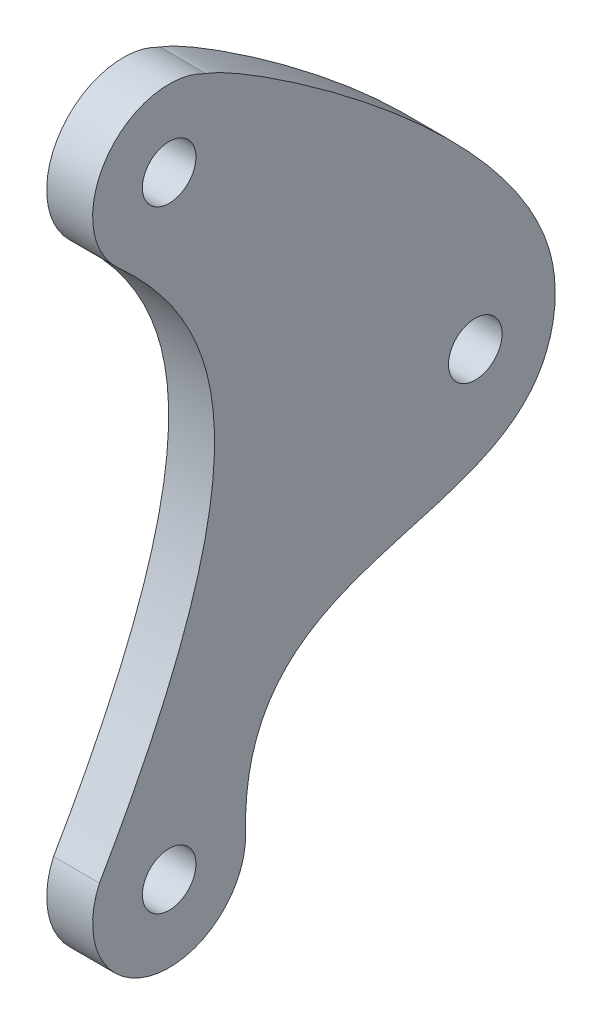
ISO-10303-21;
HEADER;
FILE_DESCRIPTION(('STEP AP214'),'2;1');
FILE_NAME('part.step','',(''),(''),'','','');
FILE_SCHEMA(('AUTOMOTIVE_DESIGN { 1 0 10303 214 1 1 1 1 }'));
ENDSEC;
DATA;
#1=APPLICATION_CONTEXT('core data for automotive mechanical design processes');
#2=APPLICATION_PROTOCOL_DEFINITION('international standard','automotive_design',2000,#1);
#3=PRODUCT_CONTEXT('',#1,'mechanical');
#4=PRODUCT('Part','Part','',(#3));
#5=PRODUCT_RELATED_PRODUCT_CATEGORY('part','',(#4));
#6=PRODUCT_DEFINITION_FORMATION('','',#4);
#7=PRODUCT_DEFINITION_CONTEXT('part definition',#1,'design');
#8=PRODUCT_DEFINITION('design','',#6,#7);
#9=PRODUCT_DEFINITION_SHAPE('','',#8);
#10=(LENGTH_UNIT() NAMED_UNIT(*) SI_UNIT(.MILLI.,.METRE.));
#11=(NAMED_UNIT(*) PLANE_ANGLE_UNIT() SI_UNIT($,.RADIAN.));
#12=(NAMED_UNIT(*) SI_UNIT($,.STERADIAN.) SOLID_ANGLE_UNIT());
#13=UNCERTAINTY_MEASURE_WITH_UNIT(LENGTH_MEASURE(1.E-05),#10,'distance_accuracy_value','');
#14=(GEOMETRIC_REPRESENTATION_CONTEXT(3) GLOBAL_UNCERTAINTY_ASSIGNED_CONTEXT((#13)) GLOBAL_UNIT_ASSIGNED_CONTEXT((#10,
#11,#12)) REPRESENTATION_CONTEXT('',''));
#15=CARTESIAN_POINT('',(0.,0.,0.));
#16=DIRECTION('',(0.,0.,1.));
#17=DIRECTION('',(1.,0.,0.));
#18=AXIS2_PLACEMENT_3D('',#15,#16,#17);
#19=CARTESIAN_POINT('',(3.,-2.09869982231491,-4.78923416984507));
#20=DIRECTION('',(1.,0.,0.));
#21=DIRECTION('',(0.,0.,-1.));
#22=AXIS2_PLACEMENT_3D('',#19,#20,#21);
#23=PLANE('',#22);
#24=CARTESIAN_POINT('',(3.,0.,0.));
#25=DIRECTION('',(1.,0.,0.));
#26=DIRECTION('',(0.,0.,-1.));
#27=AXIS2_PLACEMENT_3D('',#24,#25,#26);
#28=CIRCLE('',#27,1.75);
#29=CARTESIAN_POINT('',(3.,0.,-1.75));
#30=VERTEX_POINT('',#29);
#31=EDGE_CURVE('E147',#30,#30,#28,.T.);
#32=ORIENTED_EDGE('',*,*,#31,.F.);
#33=EDGE_LOOP('',(#32));
#34=FACE_BOUND('',#33,.T.);
#35=CARTESIAN_POINT('',(3.,-20.,15.));
#36=CARTESIAN_POINT('',(3.,-5.27096671163853,15.4667605474883));
#37=CARTESIAN_POINT('',(3.,-11.668910874409,-3.89793613911947));
#38=CARTESIAN_POINT('',(3.,9.64796348627327,-6.64863091226332));
#39=CARTESIAN_POINT('',(3.,23.8968573471168,15.5632119029051));
#40=CARTESIAN_POINT('',(3.,24.3598202807627,17.5521505112752));
#41=B_SPLINE_CURVE_WITH_KNOTS('',3,(#35,#36,#37,#38,#39,#40),.UNSPECIFIED.,.F.,.F.,(4,1,1,4),
(0.,0.482956450976032,0.582956450976032,1.),.UNSPECIFIED.);
#42=CARTESIAN_POINT('',(3.,-20.,15.));
#43=VERTEX_POINT('',#42);
#44=CARTESIAN_POINT('',(3.,24.3598202807627,17.5521505112753));
#45=VERTEX_POINT('',#44);
#46=EDGE_CURVE('E85',#43,#45,#41,.T.);
#47=ORIENTED_EDGE('',*,*,#46,.T.);
#48=CARTESIAN_POINT('',(3.,20.,20.));
#49=DIRECTION('',(1.,0.,0.));
#50=DIRECTION('',(0.,0.,-1.));
#51=AXIS2_PLACEMENT_3D('',#48,#49,#50);
#52=CIRCLE('',#51,5.);
#53=CARTESIAN_POINT('',(3.,16.4362249526584,23.5070653560983));
#54=VERTEX_POINT('',#53);
#55=EDGE_CURVE('E80',#45,#54,#52,.T.);
#56=ORIENTED_EDGE('',*,*,#55,.T.);
#57=CARTESIAN_POINT('',(3.,16.4362249526584,23.5070653560983));
#58=CARTESIAN_POINT('',(3.,9.61233454350743,15.9412169681942));
#59=CARTESIAN_POINT('',(3.,1.19356584508964,13.4830331726943));
#60=CARTESIAN_POINT('',(3.,-17.9320628826746,24.5523220535006));
#61=B_SPLINE_CURVE_WITH_KNOTS('',3,(#57,#58,#59,#60),.UNSPECIFIED.,.F.,.F.,(4,4),(0.,1.),.UNSPECIFIED.);
#62=CARTESIAN_POINT('',(3.,-17.9320628826746,24.5523220535006));
#63=VERTEX_POINT('',#62);
#64=EDGE_CURVE('E83',#54,#63,#61,.T.);
#65=ORIENTED_EDGE('',*,*,#64,.T.);
#66=CARTESIAN_POINT('',(3.,-20.,20.));
#67=DIRECTION('',(1.,0.,0.));
#68=DIRECTION('',(0.,0.,-1.));
#69=AXIS2_PLACEMENT_3D('',#66,#67,#68);
#70=CIRCLE('',#69,5.);
#71=EDGE_CURVE('E50',#63,#43,#70,.T.);
#72=ORIENTED_EDGE('',*,*,#71,.T.);
#73=EDGE_LOOP('',(#47,#56,#65,#72));
#74=FACE_BOUND('',#73,.T.);
#75=CARTESIAN_POINT('',(3.,20.,20.));
#76=DIRECTION('',(1.,0.,0.));
#77=DIRECTION('',(0.,0.,-1.));
#78=AXIS2_PLACEMENT_3D('',#75,#76,#77);
#79=CIRCLE('',#78,1.75);
#80=CARTESIAN_POINT('',(3.,20.,18.25));
#81=VERTEX_POINT('',#80);
#82=EDGE_CURVE('E153',#81,#81,#79,.T.);
#83=ORIENTED_EDGE('',*,*,#82,.F.);
#84=EDGE_LOOP('',(#83));
#85=FACE_BOUND('',#84,.T.);
#86=CARTESIAN_POINT('',(3.,-20.,20.));
#87=DIRECTION('',(1.,0.,0.));
#88=DIRECTION('',(0.,0.,-1.));
#89=AXIS2_PLACEMENT_3D('',#86,#87,#88);
#90=CIRCLE('',#89,1.75);
#91=CARTESIAN_POINT('',(3.,-20.,18.25));
#92=VERTEX_POINT('',#91);
#93=EDGE_CURVE('E138',#92,#92,#90,.T.);
#94=ORIENTED_EDGE('',*,*,#93,.F.);
#95=EDGE_LOOP('',(#94));
#96=FACE_BOUND('',#95,.T.);
#97=ADVANCED_FACE('F32',(#34,#74,#85,#96),#23,.T.);
#98=CARTESIAN_POINT('',(0.,-2.09869982231491,-4.78923416984507));
#99=DIRECTION('',(1.,0.,0.));
#100=DIRECTION('',(0.,0.,-1.));
#101=AXIS2_PLACEMENT_3D('',#98,#99,#100);
#102=PLANE('',#101);
#103=CARTESIAN_POINT('',(0.,0.,0.));
#104=DIRECTION('',(1.,0.,0.));
#105=DIRECTION('',(0.,0.,-1.));
#106=AXIS2_PLACEMENT_3D('',#103,#104,#105);
#107=CIRCLE('',#106,1.75);
#108=CARTESIAN_POINT('',(0.,0.,-1.75));
#109=VERTEX_POINT('',#108);
#110=EDGE_CURVE('E144',#109,#109,#107,.T.);
#111=ORIENTED_EDGE('',*,*,#110,.T.);
#112=EDGE_LOOP('',(#111));
#113=FACE_BOUND('',#112,.T.);
#114=CARTESIAN_POINT('',(0.,-20.,15.));
#115=CARTESIAN_POINT('',(0.,-5.27096671163853,15.4667605474883));
#116=CARTESIAN_POINT('',(0.,-11.668910874409,-3.89793613911947));
#117=CARTESIAN_POINT('',(0.,9.64796348627327,-6.64863091226332));
#118=CARTESIAN_POINT('',(0.,23.8968573471168,15.5632119029051));
#119=CARTESIAN_POINT('',(0.,24.3598202807627,17.5521505112752));
#120=B_SPLINE_CURVE_WITH_KNOTS('',3,(#114,#115,#116,#117,#118,#119),.UNSPECIFIED.,.F.,.F.,(4,1,
1,4),(0.,0.482956450976032,0.582956450976032,1.),.UNSPECIFIED.);
#121=CARTESIAN_POINT('',(0.,-20.,15.));
#122=VERTEX_POINT('',#121);
#123=CARTESIAN_POINT('',(0.,24.3598202807627,17.5521505112753));
#124=VERTEX_POINT('',#123);
#125=EDGE_CURVE('E156',#122,#124,#120,.T.);
#126=ORIENTED_EDGE('',*,*,#125,.F.);
#127=CARTESIAN_POINT('',(0.,-20.,20.));
#128=DIRECTION('',(1.,0.,0.));
#129=DIRECTION('',(0.,0.,-1.));
#130=AXIS2_PLACEMENT_3D('',#127,#128,#129);
#131=CIRCLE('',#130,5.);
#132=CARTESIAN_POINT('',(0.,-17.9320628826746,24.5523220535006));
#133=VERTEX_POINT('',#132);
#134=EDGE_CURVE('E73',#133,#122,#131,.T.);
#135=ORIENTED_EDGE('',*,*,#134,.F.);
#136=CARTESIAN_POINT('',(0.,16.4362249526584,23.5070653560983));
#137=CARTESIAN_POINT('',(0.,9.61233454350743,15.9412169681942));
#138=CARTESIAN_POINT('',(0.,1.19356584508964,13.4830331726943));
#139=CARTESIAN_POINT('',(0.,-17.9320628826746,24.5523220535006));
#140=B_SPLINE_CURVE_WITH_KNOTS('',3,(#136,#137,#138,#139),.UNSPECIFIED.,.F.,.F.,(4,4),(0.,1.),.UNSPECIFIED.);
#141=CARTESIAN_POINT('',(0.,16.4362249526584,23.5070653560983));
#142=VERTEX_POINT('',#141);
#143=EDGE_CURVE('E67',#142,#133,#140,.T.);
#144=ORIENTED_EDGE('',*,*,#143,.F.);
#145=CARTESIAN_POINT('',(0.,20.,20.));
#146=DIRECTION('',(1.,0.,0.));
#147=DIRECTION('',(0.,0.,-1.));
#148=AXIS2_PLACEMENT_3D('',#145,#146,#147);
#149=CIRCLE('',#148,5.);
#150=EDGE_CURVE('E89',#124,#142,#149,.T.);
#151=ORIENTED_EDGE('',*,*,#150,.F.);
#152=EDGE_LOOP('',(#126,#135,#144,#151));
#153=FACE_BOUND('',#152,.T.);
#154=CARTESIAN_POINT('',(0.,20.,20.));
#155=DIRECTION('',(1.,0.,0.));
#156=DIRECTION('',(0.,0.,-1.));
#157=AXIS2_PLACEMENT_3D('',#154,#155,#156);
#158=CIRCLE('',#157,1.75);
#159=CARTESIAN_POINT('',(0.,20.,18.25));
#160=VERTEX_POINT('',#159);
#161=EDGE_CURVE('E150',#160,#160,#158,.T.);
#162=ORIENTED_EDGE('',*,*,#161,.T.);
#163=EDGE_LOOP('',(#162));
#164=FACE_BOUND('',#163,.T.);
#165=CARTESIAN_POINT('',(0.,-20.,20.));
#166=DIRECTION('',(1.,0.,0.));
#167=DIRECTION('',(0.,0.,-1.));
#168=AXIS2_PLACEMENT_3D('',#165,#166,#167);
#169=CIRCLE('',#168,1.75);
#170=CARTESIAN_POINT('',(0.,-20.,18.25));
#171=VERTEX_POINT('',#170);
#172=EDGE_CURVE('E141',#171,#171,#169,.T.);
#173=ORIENTED_EDGE('',*,*,#172,.T.);
#174=EDGE_LOOP('',(#173));
#175=FACE_BOUND('',#174,.T.);
#176=ADVANCED_FACE('F111',(#113,#153,#164,#175),#102,.F.);
#177=DIRECTION('',(-1.,0.,0.));
#178=VECTOR('',#177,1.);
#179=SURFACE_OF_LINEAR_EXTRUSION('',#41,#178);
#180=ORIENTED_EDGE('',*,*,#125,.T.);
#181=DIRECTION('',(-1.,0.,0.));
#182=VECTOR('',#181,1.);
#183=CARTESIAN_POINT('',(3.,24.3598202807627,17.5521505112753));
#184=LINE('',#183,#182);
#185=EDGE_CURVE('E11',#45,#124,#184,.T.);
#186=ORIENTED_EDGE('',*,*,#185,.F.);
#187=ORIENTED_EDGE('',*,*,#46,.F.);
#188=DIRECTION('',(-1.,0.,0.));
#189=VECTOR('',#188,1.);
#190=CARTESIAN_POINT('',(3.,-20.,15.));
#191=LINE('',#190,#189);
#192=EDGE_CURVE('E93',#43,#122,#191,.T.);
#193=ORIENTED_EDGE('',*,*,#192,.T.);
#194=EDGE_LOOP('',(#180,#186,#187,#193));
#195=FACE_BOUND('',#194,.T.);
#196=ADVANCED_FACE('F34',(#195),#179,.F.);
#197=CARTESIAN_POINT('',(3.,20.,20.));
#198=DIRECTION('',(-1.,0.,0.));
#199=DIRECTION('',(0.,0.,1.));
#200=AXIS2_PLACEMENT_3D('',#197,#198,#199);
#201=CYLINDRICAL_SURFACE('',#200,5.);
#202=ORIENTED_EDGE('',*,*,#150,.T.);
#203=DIRECTION('',(-1.,0.,0.));
#204=VECTOR('',#203,1.);
#205=CARTESIAN_POINT('',(3.,16.4362249526584,23.5070653560983));
#206=LINE('',#205,#204);
#207=EDGE_CURVE('E42',#54,#142,#206,.T.);
#208=ORIENTED_EDGE('',*,*,#207,.F.);
#209=ORIENTED_EDGE('',*,*,#55,.F.);
#210=ORIENTED_EDGE('',*,*,#185,.T.);
#211=EDGE_LOOP('',(#202,#208,#209,#210));
#212=FACE_BOUND('',#211,.T.);
#213=ADVANCED_FACE('F88',(#212),#201,.T.);
#214=DIRECTION('',(-1.,0.,0.));
#215=VECTOR('',#214,1.);
#216=SURFACE_OF_LINEAR_EXTRUSION('',#61,#215);
#217=ORIENTED_EDGE('',*,*,#143,.T.);
#218=DIRECTION('',(-1.,0.,0.));
#219=VECTOR('',#218,1.);
#220=CARTESIAN_POINT('',(3.,-17.9320628826746,24.5523220535006));
#221=LINE('',#220,#219);
#222=EDGE_CURVE('E90',#63,#133,#221,.T.);
#223=ORIENTED_EDGE('',*,*,#222,.F.);
#224=ORIENTED_EDGE('',*,*,#64,.F.);
#225=ORIENTED_EDGE('',*,*,#207,.T.);
#226=EDGE_LOOP('',(#217,#223,#224,#225));
#227=FACE_BOUND('',#226,.T.);
#228=ADVANCED_FACE('F91',(#227),#216,.F.);
#229=CARTESIAN_POINT('',(3.,-20.,20.));
#230=DIRECTION('',(-1.,0.,0.));
#231=DIRECTION('',(0.,0.,1.));
#232=AXIS2_PLACEMENT_3D('',#229,#230,#231);
#233=CYLINDRICAL_SURFACE('',#232,5.);
#234=ORIENTED_EDGE('',*,*,#134,.T.);
#235=ORIENTED_EDGE('',*,*,#192,.F.);
#236=ORIENTED_EDGE('',*,*,#71,.F.);
#237=ORIENTED_EDGE('',*,*,#222,.T.);
#238=EDGE_LOOP('',(#234,#235,#236,#237));
#239=FACE_BOUND('',#238,.T.);
#240=ADVANCED_FACE('F105',(#239),#233,.T.);
#241=CARTESIAN_POINT('',(3.,20.,20.));
#242=DIRECTION('',(-1.,0.,0.));
#243=DIRECTION('',(0.,0.,1.));
#244=AXIS2_PLACEMENT_3D('',#241,#242,#243);
#245=CYLINDRICAL_SURFACE('',#244,1.75);
#246=ORIENTED_EDGE('',*,*,#82,.T.);
#247=EDGE_LOOP('',(#246));
#248=FACE_BOUND('',#247,.T.);
#249=ORIENTED_EDGE('',*,*,#161,.F.);
#250=EDGE_LOOP('',(#249));
#251=FACE_BOUND('',#250,.T.);
#252=ADVANCED_FACE('F122',(#248,#251),#245,.F.);
#253=CARTESIAN_POINT('',(3.,0.,0.));
#254=DIRECTION('',(-1.,0.,0.));
#255=DIRECTION('',(0.,0.,1.));
#256=AXIS2_PLACEMENT_3D('',#253,#254,#255);
#257=CYLINDRICAL_SURFACE('',#256,1.75);
#258=ORIENTED_EDGE('',*,*,#31,.T.);
#259=EDGE_LOOP('',(#258));
#260=FACE_BOUND('',#259,.T.);
#261=ORIENTED_EDGE('',*,*,#110,.F.);
#262=EDGE_LOOP('',(#261));
#263=FACE_BOUND('',#262,.T.);
#264=ADVANCED_FACE('F125',(#260,#263),#257,.F.);
#265=CARTESIAN_POINT('',(3.,-20.,20.));
#266=DIRECTION('',(-1.,0.,0.));
#267=DIRECTION('',(0.,0.,1.));
#268=AXIS2_PLACEMENT_3D('',#265,#266,#267);
#269=CYLINDRICAL_SURFACE('',#268,1.75);
#270=ORIENTED_EDGE('',*,*,#93,.T.);
#271=EDGE_LOOP('',(#270));
#272=FACE_BOUND('',#271,.T.);
#273=ORIENTED_EDGE('',*,*,#172,.F.);
#274=EDGE_LOOP('',(#273));
#275=FACE_BOUND('',#274,.T.);
#276=ADVANCED_FACE('F129',(#272,#275),#269,.F.);
#277=CLOSED_SHELL('',(#97,#176,#196,#213,#228,#240,#252,#264,#276));
#278=MANIFOLD_SOLID_BREP('B2',#277);
#279=ADVANCED_BREP_SHAPE_REPRESENTATION('',(#18,#278),#14);
#280=SHAPE_DEFINITION_REPRESENTATION(#9,#279);
ENDSEC;
END-ISO-10303-21;
